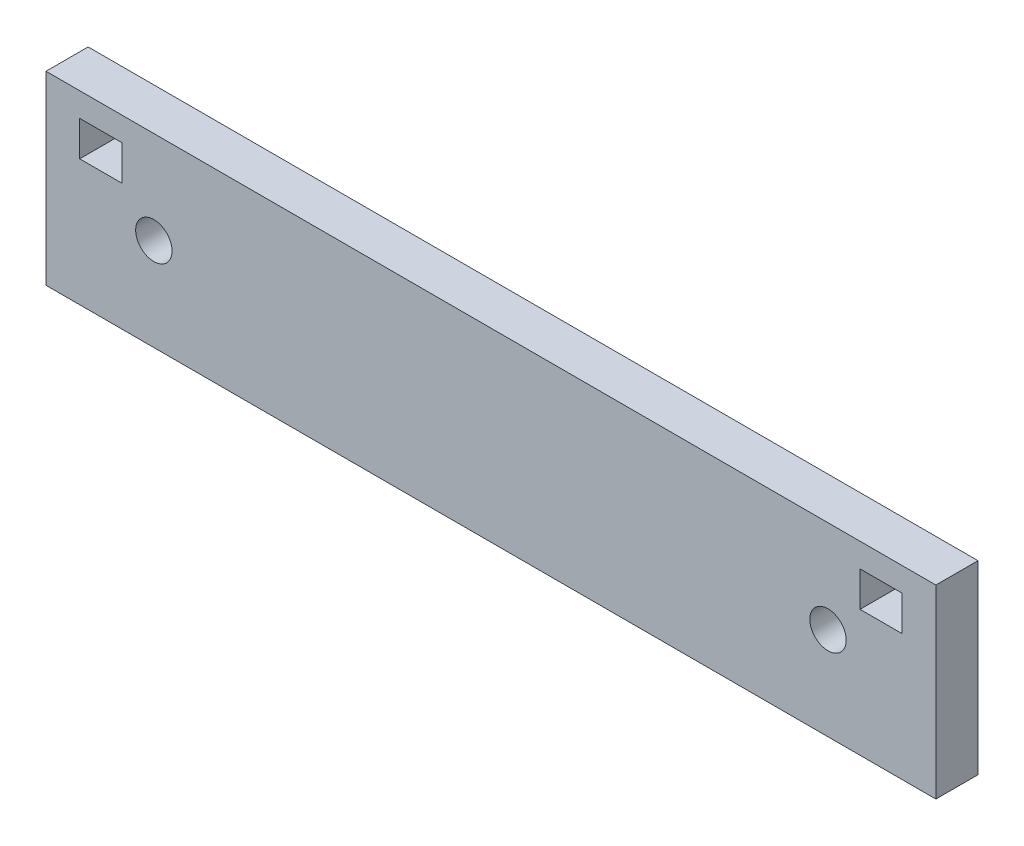
ISO-10303-21;
HEADER;
FILE_DESCRIPTION(('STEP AP214'),'2;1');
FILE_NAME('part.step','',(''),(''),'','','');
FILE_SCHEMA(('AUTOMOTIVE_DESIGN { 1 0 10303 214 1 1 1 1 }'));
ENDSEC;
DATA;
#1=APPLICATION_CONTEXT('core data for automotive mechanical design processes');
#2=APPLICATION_PROTOCOL_DEFINITION('international standard','automotive_design',2000,#1);
#3=PRODUCT_CONTEXT('',#1,'mechanical');
#4=PRODUCT('Part','Part','',(#3));
#5=PRODUCT_RELATED_PRODUCT_CATEGORY('part','',(#4));
#6=PRODUCT_DEFINITION_FORMATION('','',#4);
#7=PRODUCT_DEFINITION_CONTEXT('part definition',#1,'design');
#8=PRODUCT_DEFINITION('design','',#6,#7);
#9=PRODUCT_DEFINITION_SHAPE('','',#8);
#10=(LENGTH_UNIT() NAMED_UNIT(*) SI_UNIT(.MILLI.,.METRE.));
#11=(NAMED_UNIT(*) PLANE_ANGLE_UNIT() SI_UNIT($,.RADIAN.));
#12=(NAMED_UNIT(*) SI_UNIT($,.STERADIAN.) SOLID_ANGLE_UNIT());
#13=UNCERTAINTY_MEASURE_WITH_UNIT(LENGTH_MEASURE(1.E-05),#10,'distance_accuracy_value','');
#14=(GEOMETRIC_REPRESENTATION_CONTEXT(3) GLOBAL_UNCERTAINTY_ASSIGNED_CONTEXT((#13)) GLOBAL_UNIT_ASSIGNED_CONTEXT((#10,
#11,#12)) REPRESENTATION_CONTEXT('',''));
#15=CARTESIAN_POINT('',(0.,0.,0.));
#16=DIRECTION('',(0.,0.,1.));
#17=DIRECTION('',(1.,0.,0.));
#18=AXIS2_PLACEMENT_3D('',#15,#16,#17);
#19=CARTESIAN_POINT('',(-16.764,3.4925,1.5875));
#20=DIRECTION('',(0.,0.,1.));
#21=DIRECTION('',(1.,0.,0.));
#22=AXIS2_PLACEMENT_3D('',#19,#20,#21);
#23=PLANE('',#22);
#24=CARTESIAN_POINT('',(-12.7,0.,1.5875));
#25=DIRECTION('',(0.,0.,1.));
#26=DIRECTION('',(1.,0.,0.));
#27=AXIS2_PLACEMENT_3D('',#24,#25,#26);
#28=CIRCLE('',#27,0.685800000000001);
#29=CARTESIAN_POINT('',(-12.0142,0.,1.5875));
#30=VERTEX_POINT('',#29);
#31=EDGE_CURVE('E151',#30,#30,#28,.T.);
#32=ORIENTED_EDGE('',*,*,#31,.F.);
#33=EDGE_LOOP('',(#32));
#34=FACE_BOUND('',#33,.T.);
#35=DIRECTION('',(0.,-1.,0.));
#36=VECTOR('',#35,1.);
#37=CARTESIAN_POINT('',(-15.494,2.5908,1.5875));
#38=LINE('',#37,#36);
#39=CARTESIAN_POINT('',(-15.494,2.5908,1.5875));
#40=VERTEX_POINT('',#39);
#41=CARTESIAN_POINT('',(-15.494,1.27,1.5875));
#42=VERTEX_POINT('',#41);
#43=EDGE_CURVE('E163',#40,#42,#38,.T.);
#44=ORIENTED_EDGE('',*,*,#43,.F.);
#45=DIRECTION('',(-1.,0.,0.));
#46=VECTOR('',#45,1.);
#47=CARTESIAN_POINT('',(-13.9065,2.5908,1.5875));
#48=LINE('',#47,#46);
#49=CARTESIAN_POINT('',(-13.9065,2.5908,1.5875));
#50=VERTEX_POINT('',#49);
#51=EDGE_CURVE('E161',#50,#40,#48,.T.);
#52=ORIENTED_EDGE('',*,*,#51,.F.);
#53=DIRECTION('',(0.,1.,0.));
#54=VECTOR('',#53,1.);
#55=CARTESIAN_POINT('',(-13.9065,1.27,1.5875));
#56=LINE('',#55,#54);
#57=CARTESIAN_POINT('',(-13.9065,1.27,1.5875));
#58=VERTEX_POINT('',#57);
#59=EDGE_CURVE('E169',#58,#50,#56,.T.);
#60=ORIENTED_EDGE('',*,*,#59,.F.);
#61=DIRECTION('',(1.,0.,0.));
#62=VECTOR('',#61,1.);
#63=CARTESIAN_POINT('',(-15.494,1.27,1.5875));
#64=LINE('',#63,#62);
#65=EDGE_CURVE('E166',#42,#58,#64,.T.);
#66=ORIENTED_EDGE('',*,*,#65,.F.);
#67=EDGE_LOOP('',(#44,#52,#60,#66));
#68=FACE_BOUND('',#67,.T.);
#69=DIRECTION('',(0.,-1.,0.));
#70=VECTOR('',#69,1.);
#71=CARTESIAN_POINT('',(-16.764,-3.4925,1.5875));
#72=LINE('',#71,#70);
#73=CARTESIAN_POINT('',(-16.764,3.4925,1.5875));
#74=VERTEX_POINT('',#73);
#75=CARTESIAN_POINT('',(-16.764,-3.4925,1.5875));
#76=VERTEX_POINT('',#75);
#77=EDGE_CURVE('E192',#74,#76,#72,.T.);
#78=ORIENTED_EDGE('',*,*,#77,.T.);
#79=DIRECTION('',(1.,0.,0.));
#80=VECTOR('',#79,1.);
#81=CARTESIAN_POINT('',(16.764,-3.4925,1.5875));
#82=LINE('',#81,#80);
#83=CARTESIAN_POINT('',(16.764,-3.4925,1.5875));
#84=VERTEX_POINT('',#83);
#85=EDGE_CURVE('E195',#76,#84,#82,.T.);
#86=ORIENTED_EDGE('',*,*,#85,.T.);
#87=DIRECTION('',(0.,1.,0.));
#88=VECTOR('',#87,1.);
#89=CARTESIAN_POINT('',(16.764,-3.4925,1.5875));
#90=LINE('',#89,#88);
#91=CARTESIAN_POINT('',(16.764,3.4925,1.5875));
#92=VERTEX_POINT('',#91);
#93=EDGE_CURVE('E198',#84,#92,#90,.T.);
#94=ORIENTED_EDGE('',*,*,#93,.T.);
#95=DIRECTION('',(-1.,0.,0.));
#96=VECTOR('',#95,1.);
#97=CARTESIAN_POINT('',(16.764,3.4925,1.5875));
#98=LINE('',#97,#96);
#99=EDGE_CURVE('E200',#92,#74,#98,.T.);
#100=ORIENTED_EDGE('',*,*,#99,.T.);
#101=EDGE_LOOP('',(#78,#86,#94,#100));
#102=FACE_BOUND('',#101,.T.);
#103=DIRECTION('',(-1.,0.,0.));
#104=VECTOR('',#103,1.);
#105=CARTESIAN_POINT('',(13.9065,2.5908,1.5875));
#106=LINE('',#105,#104);
#107=CARTESIAN_POINT('',(15.494,2.5908,1.5875));
#108=VERTEX_POINT('',#107);
#109=CARTESIAN_POINT('',(13.9065,2.5908,1.5875));
#110=VERTEX_POINT('',#109);
#111=EDGE_CURVE('E130',#108,#110,#106,.T.);
#112=ORIENTED_EDGE('',*,*,#111,.F.);
#113=DIRECTION('',(0.,1.,0.));
#114=VECTOR('',#113,1.);
#115=CARTESIAN_POINT('',(15.494,2.5908,1.5875));
#116=LINE('',#115,#114);
#117=CARTESIAN_POINT('',(15.494,1.27,1.5875));
#118=VERTEX_POINT('',#117);
#119=EDGE_CURVE('E122',#118,#108,#116,.T.);
#120=ORIENTED_EDGE('',*,*,#119,.F.);
#121=DIRECTION('',(1.,0.,0.));
#122=VECTOR('',#121,1.);
#123=CARTESIAN_POINT('',(15.494,1.27,1.5875));
#124=LINE('',#123,#122);
#125=CARTESIAN_POINT('',(13.9065,1.27,1.5875));
#126=VERTEX_POINT('',#125);
#127=EDGE_CURVE('E145',#126,#118,#124,.T.);
#128=ORIENTED_EDGE('',*,*,#127,.F.);
#129=DIRECTION('',(0.,-1.,0.));
#130=VECTOR('',#129,1.);
#131=CARTESIAN_POINT('',(13.9065,1.27,1.5875));
#132=LINE('',#131,#130);
#133=EDGE_CURVE('E143',#110,#126,#132,.T.);
#134=ORIENTED_EDGE('',*,*,#133,.F.);
#135=EDGE_LOOP('',(#112,#120,#128,#134));
#136=FACE_BOUND('',#135,.T.);
#137=CARTESIAN_POINT('',(12.7,0.,1.5875));
#138=DIRECTION('',(0.,0.,1.));
#139=DIRECTION('',(-1.,0.,0.));
#140=AXIS2_PLACEMENT_3D('',#137,#138,#139);
#141=CIRCLE('',#140,0.685800000000001);
#142=CARTESIAN_POINT('',(12.0142,0.,1.5875));
#143=VERTEX_POINT('',#142);
#144=EDGE_CURVE('E310',#143,#143,#141,.T.);
#145=ORIENTED_EDGE('',*,*,#144,.F.);
#146=EDGE_LOOP('',(#145));
#147=FACE_BOUND('',#146,.T.);
#148=ADVANCED_FACE('F33',(#34,#68,#102,#136,#147),#23,.T.);
#149=CARTESIAN_POINT('',(-16.764,3.4925,0.));
#150=DIRECTION('',(0.,0.,1.));
#151=DIRECTION('',(1.,0.,0.));
#152=AXIS2_PLACEMENT_3D('',#149,#150,#151);
#153=PLANE('',#152);
#154=CARTESIAN_POINT('',(-12.7,0.,0.));
#155=DIRECTION('',(0.,0.,1.));
#156=DIRECTION('',(1.,0.,0.));
#157=AXIS2_PLACEMENT_3D('',#154,#155,#156);
#158=CIRCLE('',#157,0.685800000000001);
#159=CARTESIAN_POINT('',(-12.0142,0.,0.));
#160=VERTEX_POINT('',#159);
#161=EDGE_CURVE('E316',#160,#160,#158,.T.);
#162=ORIENTED_EDGE('',*,*,#161,.T.);
#163=EDGE_LOOP('',(#162));
#164=FACE_BOUND('',#163,.T.);
#165=DIRECTION('',(-1.,0.,0.));
#166=VECTOR('',#165,1.);
#167=CARTESIAN_POINT('',(-13.9065,2.5908,0.));
#168=LINE('',#167,#166);
#169=CARTESIAN_POINT('',(-13.9065,2.5908,0.));
#170=VERTEX_POINT('',#169);
#171=CARTESIAN_POINT('',(-15.494,2.5908,0.));
#172=VERTEX_POINT('',#171);
#173=EDGE_CURVE('E138',#170,#172,#168,.T.);
#174=ORIENTED_EDGE('',*,*,#173,.T.);
#175=DIRECTION('',(0.,-1.,0.));
#176=VECTOR('',#175,1.);
#177=CARTESIAN_POINT('',(-15.494,2.5908,0.));
#178=LINE('',#177,#176);
#179=CARTESIAN_POINT('',(-15.494,1.27,0.));
#180=VERTEX_POINT('',#179);
#181=EDGE_CURVE('E174',#172,#180,#178,.T.);
#182=ORIENTED_EDGE('',*,*,#181,.T.);
#183=DIRECTION('',(1.,0.,0.));
#184=VECTOR('',#183,1.);
#185=CARTESIAN_POINT('',(-15.494,1.27,0.));
#186=LINE('',#185,#184);
#187=CARTESIAN_POINT('',(-13.9065,1.27,0.));
#188=VERTEX_POINT('',#187);
#189=EDGE_CURVE('E177',#180,#188,#186,.T.);
#190=ORIENTED_EDGE('',*,*,#189,.T.);
#191=DIRECTION('',(0.,1.,0.));
#192=VECTOR('',#191,1.);
#193=CARTESIAN_POINT('',(-13.9065,1.27,0.));
#194=LINE('',#193,#192);
#195=EDGE_CURVE('E164',#188,#170,#194,.T.);
#196=ORIENTED_EDGE('',*,*,#195,.T.);
#197=EDGE_LOOP('',(#174,#182,#190,#196));
#198=FACE_BOUND('',#197,.T.);
#199=DIRECTION('',(0.,-1.,0.));
#200=VECTOR('',#199,1.);
#201=CARTESIAN_POINT('',(-16.764,-3.4925,0.));
#202=LINE('',#201,#200);
#203=CARTESIAN_POINT('',(-16.764,3.4925,0.));
#204=VERTEX_POINT('',#203);
#205=CARTESIAN_POINT('',(-16.764,-3.4925,0.));
#206=VERTEX_POINT('',#205);
#207=EDGE_CURVE('E191',#204,#206,#202,.T.);
#208=ORIENTED_EDGE('',*,*,#207,.F.);
#209=DIRECTION('',(-1.,0.,0.));
#210=VECTOR('',#209,1.);
#211=CARTESIAN_POINT('',(16.764,3.4925,0.));
#212=LINE('',#211,#210);
#213=CARTESIAN_POINT('',(16.764,3.4925,0.));
#214=VERTEX_POINT('',#213);
#215=EDGE_CURVE('E196',#214,#204,#212,.T.);
#216=ORIENTED_EDGE('',*,*,#215,.F.);
#217=DIRECTION('',(0.,1.,0.));
#218=VECTOR('',#217,1.);
#219=CARTESIAN_POINT('',(16.764,-3.4925,0.));
#220=LINE('',#219,#218);
#221=CARTESIAN_POINT('',(16.764,-3.4925,0.));
#222=VERTEX_POINT('',#221);
#223=EDGE_CURVE('E207',#222,#214,#220,.T.);
#224=ORIENTED_EDGE('',*,*,#223,.F.);
#225=DIRECTION('',(1.,0.,0.));
#226=VECTOR('',#225,1.);
#227=CARTESIAN_POINT('',(16.764,-3.4925,0.));
#228=LINE('',#227,#226);
#229=EDGE_CURVE('E205',#206,#222,#228,.T.);
#230=ORIENTED_EDGE('',*,*,#229,.F.);
#231=EDGE_LOOP('',(#208,#216,#224,#230));
#232=FACE_BOUND('',#231,.T.);
#233=DIRECTION('',(0.,1.,0.));
#234=VECTOR('',#233,1.);
#235=CARTESIAN_POINT('',(15.494,2.5908,0.));
#236=LINE('',#235,#234);
#237=CARTESIAN_POINT('',(15.494,1.27,0.));
#238=VERTEX_POINT('',#237);
#239=CARTESIAN_POINT('',(15.494,2.5908,0.));
#240=VERTEX_POINT('',#239);
#241=EDGE_CURVE('E56',#238,#240,#236,.T.);
#242=ORIENTED_EDGE('',*,*,#241,.T.);
#243=DIRECTION('',(-1.,0.,0.));
#244=VECTOR('',#243,1.);
#245=CARTESIAN_POINT('',(13.9065,2.5908,0.));
#246=LINE('',#245,#244);
#247=CARTESIAN_POINT('',(13.9065,2.5908,0.));
#248=VERTEX_POINT('',#247);
#249=EDGE_CURVE('E137',#240,#248,#246,.T.);
#250=ORIENTED_EDGE('',*,*,#249,.T.);
#251=DIRECTION('',(0.,-1.,0.));
#252=VECTOR('',#251,1.);
#253=CARTESIAN_POINT('',(13.9065,1.27,0.));
#254=LINE('',#253,#252);
#255=CARTESIAN_POINT('',(13.9065,1.27,0.));
#256=VERTEX_POINT('',#255);
#257=EDGE_CURVE('E153',#248,#256,#254,.T.);
#258=ORIENTED_EDGE('',*,*,#257,.T.);
#259=DIRECTION('',(1.,0.,0.));
#260=VECTOR('',#259,1.);
#261=CARTESIAN_POINT('',(15.494,1.27,0.));
#262=LINE('',#261,#260);
#263=EDGE_CURVE('E131',#256,#238,#262,.T.);
#264=ORIENTED_EDGE('',*,*,#263,.T.);
#265=EDGE_LOOP('',(#242,#250,#258,#264));
#266=FACE_BOUND('',#265,.T.);
#267=CARTESIAN_POINT('',(12.7,0.,0.));
#268=DIRECTION('',(0.,0.,1.));
#269=DIRECTION('',(-1.,0.,0.));
#270=AXIS2_PLACEMENT_3D('',#267,#268,#269);
#271=CIRCLE('',#270,0.685800000000001);
#272=CARTESIAN_POINT('',(12.0142,0.,0.));
#273=VERTEX_POINT('',#272);
#274=EDGE_CURVE('E313',#273,#273,#271,.T.);
#275=ORIENTED_EDGE('',*,*,#274,.T.);
#276=EDGE_LOOP('',(#275));
#277=FACE_BOUND('',#276,.T.);
#278=ADVANCED_FACE('F225',(#164,#198,#232,#266,#277),#153,.F.);
#279=CARTESIAN_POINT('',(-16.764,-3.4925,1.5875));
#280=DIRECTION('',(1.,0.,0.));
#281=DIRECTION('',(0.,0.,-1.));
#282=AXIS2_PLACEMENT_3D('',#279,#280,#281);
#283=PLANE('',#282);
#284=ORIENTED_EDGE('',*,*,#207,.T.);
#285=DIRECTION('',(0.,0.,-1.));
#286=VECTOR('',#285,1.);
#287=CARTESIAN_POINT('',(-16.764,-3.4925,1.5875));
#288=LINE('',#287,#286);
#289=EDGE_CURVE('E11',#76,#206,#288,.T.);
#290=ORIENTED_EDGE('',*,*,#289,.F.);
#291=ORIENTED_EDGE('',*,*,#77,.F.);
#292=DIRECTION('',(0.,0.,-1.));
#293=VECTOR('',#292,1.);
#294=CARTESIAN_POINT('',(-16.764,3.4925,1.5875));
#295=LINE('',#294,#293);
#296=EDGE_CURVE('E202',#74,#204,#295,.T.);
#297=ORIENTED_EDGE('',*,*,#296,.T.);
#298=EDGE_LOOP('',(#284,#290,#291,#297));
#299=FACE_BOUND('',#298,.T.);
#300=ADVANCED_FACE('F35',(#299),#283,.F.);
#301=CARTESIAN_POINT('',(16.764,-3.4925,1.5875));
#302=DIRECTION('',(0.,1.,0.));
#303=DIRECTION('',(-1.,0.,0.));
#304=AXIS2_PLACEMENT_3D('',#301,#302,#303);
#305=PLANE('',#304);
#306=ORIENTED_EDGE('',*,*,#229,.T.);
#307=DIRECTION('',(0.,0.,-1.));
#308=VECTOR('',#307,1.);
#309=CARTESIAN_POINT('',(16.764,-3.4925,1.5875));
#310=LINE('',#309,#308);
#311=EDGE_CURVE('E41',#84,#222,#310,.T.);
#312=ORIENTED_EDGE('',*,*,#311,.F.);
#313=ORIENTED_EDGE('',*,*,#85,.F.);
#314=ORIENTED_EDGE('',*,*,#289,.T.);
#315=EDGE_LOOP('',(#306,#312,#313,#314));
#316=FACE_BOUND('',#315,.T.);
#317=ADVANCED_FACE('F235',(#316),#305,.F.);
#318=CARTESIAN_POINT('',(16.764,-3.4925,1.5875));
#319=DIRECTION('',(-1.,0.,0.));
#320=DIRECTION('',(0.,0.,1.));
#321=AXIS2_PLACEMENT_3D('',#318,#319,#320);
#322=PLANE('',#321);
#323=ORIENTED_EDGE('',*,*,#223,.T.);
#324=DIRECTION('',(0.,0.,-1.));
#325=VECTOR('',#324,1.);
#326=CARTESIAN_POINT('',(16.764,3.4925,1.5875));
#327=LINE('',#326,#325);
#328=EDGE_CURVE('E212',#92,#214,#327,.T.);
#329=ORIENTED_EDGE('',*,*,#328,.F.);
#330=ORIENTED_EDGE('',*,*,#93,.F.);
#331=ORIENTED_EDGE('',*,*,#311,.T.);
#332=EDGE_LOOP('',(#323,#329,#330,#331));
#333=FACE_BOUND('',#332,.T.);
#334=ADVANCED_FACE('F219',(#333),#322,.F.);
#335=CARTESIAN_POINT('',(16.764,3.4925,1.5875));
#336=DIRECTION('',(0.,-1.,0.));
#337=DIRECTION('',(1.,0.,0.));
#338=AXIS2_PLACEMENT_3D('',#335,#336,#337);
#339=PLANE('',#338);
#340=ORIENTED_EDGE('',*,*,#215,.T.);
#341=ORIENTED_EDGE('',*,*,#296,.F.);
#342=ORIENTED_EDGE('',*,*,#99,.F.);
#343=ORIENTED_EDGE('',*,*,#328,.T.);
#344=EDGE_LOOP('',(#340,#341,#342,#343));
#345=FACE_BOUND('',#344,.T.);
#346=ADVANCED_FACE('F229',(#345),#339,.F.);
#347=CARTESIAN_POINT('',(-13.9065,2.5908,1.5875));
#348=DIRECTION('',(0.,-1.,0.));
#349=DIRECTION('',(1.,0.,0.));
#350=AXIS2_PLACEMENT_3D('',#347,#348,#349);
#351=PLANE('',#350);
#352=ORIENTED_EDGE('',*,*,#173,.F.);
#353=DIRECTION('',(0.,0.,-1.));
#354=VECTOR('',#353,1.);
#355=CARTESIAN_POINT('',(-13.9065,2.5908,1.5875));
#356=LINE('',#355,#354);
#357=EDGE_CURVE('E171',#50,#170,#356,.T.);
#358=ORIENTED_EDGE('',*,*,#357,.F.);
#359=ORIENTED_EDGE('',*,*,#51,.T.);
#360=DIRECTION('',(0.,0.,-1.));
#361=VECTOR('',#360,1.);
#362=CARTESIAN_POINT('',(-15.494,2.5908,1.5875));
#363=LINE('',#362,#361);
#364=EDGE_CURVE('E188',#40,#172,#363,.T.);
#365=ORIENTED_EDGE('',*,*,#364,.T.);
#366=EDGE_LOOP('',(#352,#358,#359,#365));
#367=FACE_BOUND('',#366,.T.);
#368=ADVANCED_FACE('F253',(#367),#351,.T.);
#369=CARTESIAN_POINT('',(-15.494,2.5908,1.5875));
#370=DIRECTION('',(1.,0.,0.));
#371=DIRECTION('',(0.,0.,-1.));
#372=AXIS2_PLACEMENT_3D('',#369,#370,#371);
#373=PLANE('',#372);
#374=ORIENTED_EDGE('',*,*,#181,.F.);
#375=ORIENTED_EDGE('',*,*,#364,.F.);
#376=ORIENTED_EDGE('',*,*,#43,.T.);
#377=DIRECTION('',(0.,0.,-1.));
#378=VECTOR('',#377,1.);
#379=CARTESIAN_POINT('',(-15.494,1.27,1.5875));
#380=LINE('',#379,#378);
#381=EDGE_CURVE('E186',#42,#180,#380,.T.);
#382=ORIENTED_EDGE('',*,*,#381,.T.);
#383=EDGE_LOOP('',(#374,#375,#376,#382));
#384=FACE_BOUND('',#383,.T.);
#385=ADVANCED_FACE('F260',(#384),#373,.T.);
#386=CARTESIAN_POINT('',(-15.494,1.27,1.5875));
#387=DIRECTION('',(0.,1.,0.));
#388=DIRECTION('',(-1.,0.,0.));
#389=AXIS2_PLACEMENT_3D('',#386,#387,#388);
#390=PLANE('',#389);
#391=ORIENTED_EDGE('',*,*,#189,.F.);
#392=ORIENTED_EDGE('',*,*,#381,.F.);
#393=ORIENTED_EDGE('',*,*,#65,.T.);
#394=DIRECTION('',(0.,0.,-1.));
#395=VECTOR('',#394,1.);
#396=CARTESIAN_POINT('',(-13.9065,1.27,1.5875));
#397=LINE('',#396,#395);
#398=EDGE_CURVE('E184',#58,#188,#397,.T.);
#399=ORIENTED_EDGE('',*,*,#398,.T.);
#400=EDGE_LOOP('',(#391,#392,#393,#399));
#401=FACE_BOUND('',#400,.T.);
#402=ADVANCED_FACE('F265',(#401),#390,.T.);
#403=CARTESIAN_POINT('',(-13.9065,1.27,1.5875));
#404=DIRECTION('',(-1.,0.,0.));
#405=DIRECTION('',(0.,-1.,0.));
#406=AXIS2_PLACEMENT_3D('',#403,#404,#405);
#407=PLANE('',#406);
#408=ORIENTED_EDGE('',*,*,#195,.F.);
#409=ORIENTED_EDGE('',*,*,#398,.F.);
#410=ORIENTED_EDGE('',*,*,#59,.T.);
#411=ORIENTED_EDGE('',*,*,#357,.T.);
#412=EDGE_LOOP('',(#408,#409,#410,#411));
#413=FACE_BOUND('',#412,.T.);
#414=ADVANCED_FACE('F273',(#413),#407,.T.);
#415=CARTESIAN_POINT('',(15.494,2.5908,1.5875));
#416=DIRECTION('',(-1.,0.,0.));
#417=DIRECTION('',(0.,0.,1.));
#418=AXIS2_PLACEMENT_3D('',#415,#416,#417);
#419=PLANE('',#418);
#420=ORIENTED_EDGE('',*,*,#241,.F.);
#421=DIRECTION('',(0.,0.,-1.));
#422=VECTOR('',#421,1.);
#423=CARTESIAN_POINT('',(15.494,1.27,1.5875));
#424=LINE('',#423,#422);
#425=EDGE_CURVE('E126',#118,#238,#424,.T.);
#426=ORIENTED_EDGE('',*,*,#425,.F.);
#427=ORIENTED_EDGE('',*,*,#119,.T.);
#428=DIRECTION('',(0.,0.,-1.));
#429=VECTOR('',#428,1.);
#430=CARTESIAN_POINT('',(15.494,2.5908,1.5875));
#431=LINE('',#430,#429);
#432=EDGE_CURVE('E125',#108,#240,#431,.T.);
#433=ORIENTED_EDGE('',*,*,#432,.T.);
#434=EDGE_LOOP('',(#420,#426,#427,#433));
#435=FACE_BOUND('',#434,.T.);
#436=ADVANCED_FACE('F124',(#435),#419,.T.);
#437=CARTESIAN_POINT('',(13.9065,2.5908,1.5875));
#438=DIRECTION('',(0.,-1.,0.));
#439=DIRECTION('',(1.,0.,0.));
#440=AXIS2_PLACEMENT_3D('',#437,#438,#439);
#441=PLANE('',#440);
#442=ORIENTED_EDGE('',*,*,#249,.F.);
#443=ORIENTED_EDGE('',*,*,#432,.F.);
#444=ORIENTED_EDGE('',*,*,#111,.T.);
#445=DIRECTION('',(0.,0.,-1.));
#446=VECTOR('',#445,1.);
#447=CARTESIAN_POINT('',(13.9065,2.5908,1.5875));
#448=LINE('',#447,#446);
#449=EDGE_CURVE('E139',#110,#248,#448,.T.);
#450=ORIENTED_EDGE('',*,*,#449,.T.);
#451=EDGE_LOOP('',(#442,#443,#444,#450));
#452=FACE_BOUND('',#451,.T.);
#453=ADVANCED_FACE('F134',(#452),#441,.T.);
#454=CARTESIAN_POINT('',(13.9065,1.27,1.5875));
#455=DIRECTION('',(1.,0.,0.));
#456=DIRECTION('',(0.,1.,0.));
#457=AXIS2_PLACEMENT_3D('',#454,#455,#456);
#458=PLANE('',#457);
#459=ORIENTED_EDGE('',*,*,#257,.F.);
#460=ORIENTED_EDGE('',*,*,#449,.F.);
#461=ORIENTED_EDGE('',*,*,#133,.T.);
#462=DIRECTION('',(0.,0.,-1.));
#463=VECTOR('',#462,1.);
#464=CARTESIAN_POINT('',(13.9065,1.27,1.5875));
#465=LINE('',#464,#463);
#466=EDGE_CURVE('E48',#126,#256,#465,.T.);
#467=ORIENTED_EDGE('',*,*,#466,.T.);
#468=EDGE_LOOP('',(#459,#460,#461,#467));
#469=FACE_BOUND('',#468,.T.);
#470=ADVANCED_FACE('F291',(#469),#458,.T.);
#471=CARTESIAN_POINT('',(15.494,1.27,1.5875));
#472=DIRECTION('',(0.,1.,0.));
#473=DIRECTION('',(-1.,0.,0.));
#474=AXIS2_PLACEMENT_3D('',#471,#472,#473);
#475=PLANE('',#474);
#476=ORIENTED_EDGE('',*,*,#263,.F.);
#477=ORIENTED_EDGE('',*,*,#466,.F.);
#478=ORIENTED_EDGE('',*,*,#127,.T.);
#479=ORIENTED_EDGE('',*,*,#425,.T.);
#480=EDGE_LOOP('',(#476,#477,#478,#479));
#481=FACE_BOUND('',#480,.T.);
#482=ADVANCED_FACE('F294',(#481),#475,.T.);
#483=CARTESIAN_POINT('',(-12.7,0.,1.5875));
#484=DIRECTION('',(0.,0.,-1.));
#485=DIRECTION('',(-1.,0.,0.));
#486=AXIS2_PLACEMENT_3D('',#483,#484,#485);
#487=CYLINDRICAL_SURFACE('',#486,0.685800000000001);
#488=ORIENTED_EDGE('',*,*,#31,.T.);
#489=EDGE_LOOP('',(#488));
#490=FACE_BOUND('',#489,.T.);
#491=ORIENTED_EDGE('',*,*,#161,.F.);
#492=EDGE_LOOP('',(#491));
#493=FACE_BOUND('',#492,.T.);
#494=ADVANCED_FACE('F298',(#490,#493),#487,.F.);
#495=CARTESIAN_POINT('',(12.7,0.,1.5875));
#496=DIRECTION('',(0.,0.,-1.));
#497=DIRECTION('',(-1.,0.,0.));
#498=AXIS2_PLACEMENT_3D('',#495,#496,#497);
#499=CYLINDRICAL_SURFACE('',#498,0.685800000000001);
#500=ORIENTED_EDGE('',*,*,#144,.T.);
#501=EDGE_LOOP('',(#500));
#502=FACE_BOUND('',#501,.T.);
#503=ORIENTED_EDGE('',*,*,#274,.F.);
#504=EDGE_LOOP('',(#503));
#505=FACE_BOUND('',#504,.T.);
#506=ADVANCED_FACE('F301',(#502,#505),#499,.F.);
#507=CLOSED_SHELL('',(#148,#278,#300,#317,#334,#346,#368,#385,#402,#414,#436,#453,#470,#482,
#494,#506));
#508=MANIFOLD_SOLID_BREP('B2',#507);
#509=ADVANCED_BREP_SHAPE_REPRESENTATION('',(#18,#508),#14);
#510=SHAPE_DEFINITION_REPRESENTATION(#9,#509);
ENDSEC;
END-ISO-10303-21;
